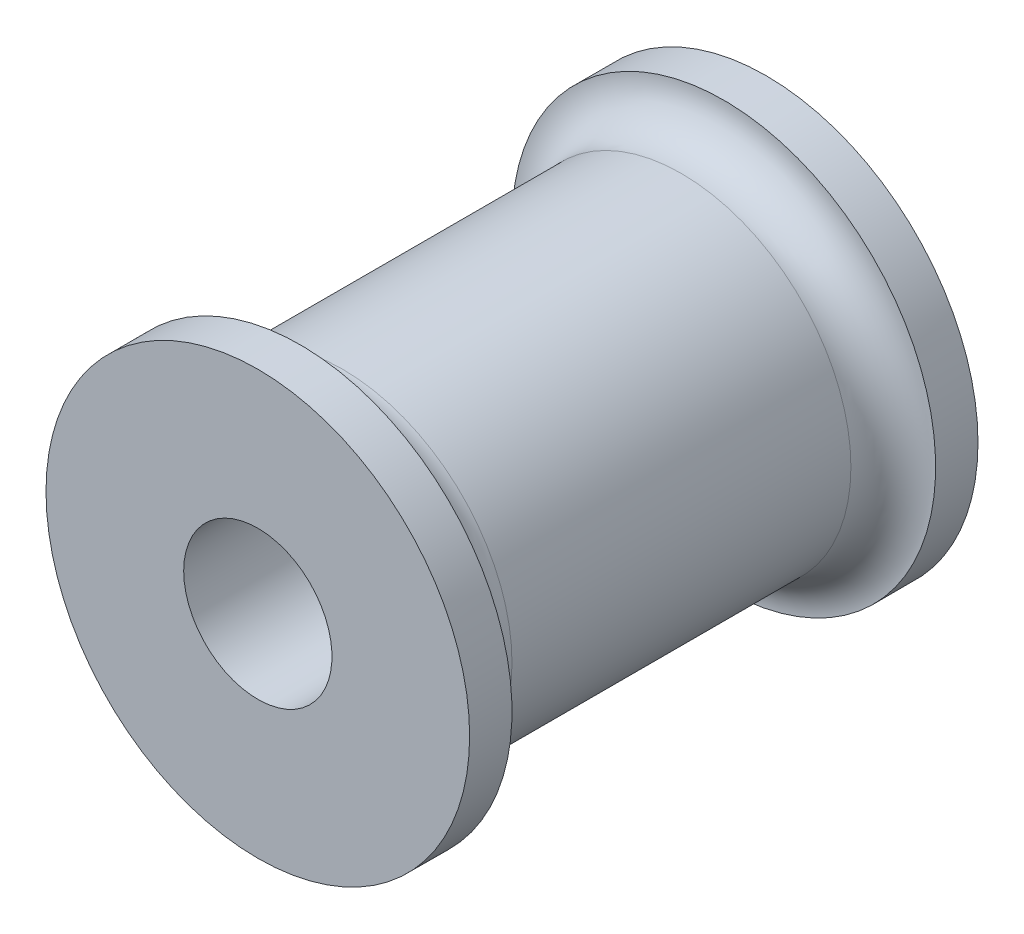
ISO-10303-21;
HEADER;
FILE_DESCRIPTION(('STEP AP214'),'2;1');
FILE_NAME('part.step','',(''),(''),'','','');
FILE_SCHEMA(('AUTOMOTIVE_DESIGN { 1 0 10303 214 1 1 1 1 }'));
ENDSEC;
DATA;
#1=APPLICATION_CONTEXT('core data for automotive mechanical design processes');
#2=APPLICATION_PROTOCOL_DEFINITION('international standard','automotive_design',2000,#1);
#3=PRODUCT_CONTEXT('',#1,'mechanical');
#4=PRODUCT('Part','Part','',(#3));
#5=PRODUCT_RELATED_PRODUCT_CATEGORY('part','',(#4));
#6=PRODUCT_DEFINITION_FORMATION('','',#4);
#7=PRODUCT_DEFINITION_CONTEXT('part definition',#1,'design');
#8=PRODUCT_DEFINITION('design','',#6,#7);
#9=PRODUCT_DEFINITION_SHAPE('','',#8);
#10=(LENGTH_UNIT() NAMED_UNIT(*) SI_UNIT(.MILLI.,.METRE.));
#11=(NAMED_UNIT(*) PLANE_ANGLE_UNIT() SI_UNIT($,.RADIAN.));
#12=(NAMED_UNIT(*) SI_UNIT($,.STERADIAN.) SOLID_ANGLE_UNIT());
#13=UNCERTAINTY_MEASURE_WITH_UNIT(LENGTH_MEASURE(1.E-05),#10,'distance_accuracy_value','');
#14=(GEOMETRIC_REPRESENTATION_CONTEXT(3) GLOBAL_UNCERTAINTY_ASSIGNED_CONTEXT((#13)) GLOBAL_UNIT_ASSIGNED_CONTEXT((#10,
#11,#12)) REPRESENTATION_CONTEXT('',''));
#15=CARTESIAN_POINT('',(0.,0.,0.));
#16=DIRECTION('',(0.,0.,1.));
#17=DIRECTION('',(1.,0.,0.));
#18=AXIS2_PLACEMENT_3D('',#15,#16,#17);
#19=CARTESIAN_POINT('',(0.,0.,24.));
#20=DIRECTION('',(0.,0.,-1.));
#21=DIRECTION('',(-1.,0.,0.));
#22=AXIS2_PLACEMENT_3D('',#19,#20,#21);
#23=CYLINDRICAL_SURFACE('',#22,10.);
#24=CARTESIAN_POINT('',(0.,0.,2.));
#25=DIRECTION('',(0.,0.,-1.));
#26=DIRECTION('',(-1.,0.,0.));
#27=AXIS2_PLACEMENT_3D('',#24,#25,#26);
#28=CIRCLE('',#27,10.);
#29=CARTESIAN_POINT('',(-10.,0.,2.));
#30=VERTEX_POINT('',#29);
#31=EDGE_CURVE('E52',#30,#30,#28,.T.);
#32=ORIENTED_EDGE('',*,*,#31,.T.);
#33=EDGE_LOOP('',(#32));
#34=FACE_BOUND('',#33,.T.);
#35=CARTESIAN_POINT('',(0.,0.,0.));
#36=DIRECTION('',(0.,0.,1.));
#37=DIRECTION('',(1.,0.,0.));
#38=AXIS2_PLACEMENT_3D('',#35,#36,#37);
#39=CIRCLE('',#38,10.);
#40=CARTESIAN_POINT('',(10.,0.,0.));
#41=VERTEX_POINT('',#40);
#42=EDGE_CURVE('E35',#41,#41,#39,.T.);
#43=ORIENTED_EDGE('',*,*,#42,.T.);
#44=EDGE_LOOP('',(#43));
#45=FACE_BOUND('',#44,.T.);
#46=ADVANCED_FACE('F31',(#34,#45),#23,.T.);
#47=CARTESIAN_POINT('',(0.,0.,0.));
#48=DIRECTION('',(0.,0.,1.));
#49=DIRECTION('',(1.,0.,0.));
#50=AXIS2_PLACEMENT_3D('',#47,#48,#49);
#51=PLANE('',#50);
#52=CARTESIAN_POINT('',(0.,0.,0.));
#53=DIRECTION('',(0.,0.,-1.));
#54=DIRECTION('',(-1.,0.,0.));
#55=AXIS2_PLACEMENT_3D('',#52,#53,#54);
#56=CIRCLE('',#55,3.5);
#57=CARTESIAN_POINT('',(-3.5,0.,0.));
#58=VERTEX_POINT('',#57);
#59=EDGE_CURVE('E56',#58,#58,#56,.T.);
#60=ORIENTED_EDGE('',*,*,#59,.F.);
#61=EDGE_LOOP('',(#60));
#62=FACE_BOUND('',#61,.T.);
#63=ORIENTED_EDGE('',*,*,#42,.F.);
#64=EDGE_LOOP('',(#63));
#65=FACE_BOUND('',#64,.T.);
#66=ADVANCED_FACE('F70',(#62,#65),#51,.F.);
#67=CARTESIAN_POINT('',(0.,0.,4.));
#68=DIRECTION('',(0.,0.,-1.));
#69=DIRECTION('',(-1.,0.,0.));
#70=AXIS2_PLACEMENT_3D('',#67,#68,#69);
#71=TOROIDAL_SURFACE('',#70,10.,2.);
#72=ORIENTED_EDGE('',*,*,#31,.F.);
#73=EDGE_LOOP('',(#72));
#74=FACE_BOUND('',#73,.T.);
#75=CARTESIAN_POINT('',(0.,0.,4.));
#76=DIRECTION('',(0.,0.,-1.));
#77=DIRECTION('',(-1.,0.,0.));
#78=AXIS2_PLACEMENT_3D('',#75,#76,#77);
#79=CIRCLE('',#78,8.);
#80=CARTESIAN_POINT('',(-8.,0.,4.));
#81=VERTEX_POINT('',#80);
#82=EDGE_CURVE('E42',#81,#81,#79,.T.);
#83=ORIENTED_EDGE('',*,*,#82,.T.);
#84=EDGE_LOOP('',(#83));
#85=FACE_BOUND('',#84,.T.);
#86=ADVANCED_FACE('F73',(#74,#85),#71,.F.);
#87=CARTESIAN_POINT('',(0.,0.,-0.3));
#88=DIRECTION('',(0.,0.,-1.));
#89=DIRECTION('',(-1.,0.,0.));
#90=AXIS2_PLACEMENT_3D('',#87,#88,#89);
#91=CYLINDRICAL_SURFACE('',#90,8.);
#92=ORIENTED_EDGE('',*,*,#82,.F.);
#93=EDGE_LOOP('',(#92));
#94=FACE_BOUND('',#93,.T.);
#95=CARTESIAN_POINT('',(0.,0.,20.));
#96=DIRECTION('',(0.,0.,-1.));
#97=DIRECTION('',(-1.,0.,0.));
#98=AXIS2_PLACEMENT_3D('',#95,#96,#97);
#99=CIRCLE('',#98,8.);
#100=CARTESIAN_POINT('',(-8.,0.,20.));
#101=VERTEX_POINT('',#100);
#102=EDGE_CURVE('E46',#101,#101,#99,.T.);
#103=ORIENTED_EDGE('',*,*,#102,.T.);
#104=EDGE_LOOP('',(#103));
#105=FACE_BOUND('',#104,.T.);
#106=ADVANCED_FACE('F91',(#94,#105),#91,.T.);
#107=CARTESIAN_POINT('',(0.,0.,20.));
#108=DIRECTION('',(0.,0.,-1.));
#109=DIRECTION('',(-1.,0.,0.));
#110=AXIS2_PLACEMENT_3D('',#107,#108,#109);
#111=TOROIDAL_SURFACE('',#110,10.,2.);
#112=ORIENTED_EDGE('',*,*,#102,.F.);
#113=EDGE_LOOP('',(#112));
#114=FACE_BOUND('',#113,.T.);
#115=CARTESIAN_POINT('',(0.,0.,22.));
#116=DIRECTION('',(0.,0.,-1.));
#117=DIRECTION('',(-1.,0.,0.));
#118=AXIS2_PLACEMENT_3D('',#115,#116,#117);
#119=CIRCLE('',#118,10.);
#120=CARTESIAN_POINT('',(-10.,0.,22.));
#121=VERTEX_POINT('',#120);
#122=EDGE_CURVE('E49',#121,#121,#119,.T.);
#123=ORIENTED_EDGE('',*,*,#122,.T.);
#124=EDGE_LOOP('',(#123));
#125=FACE_BOUND('',#124,.T.);
#126=ADVANCED_FACE('F85',(#114,#125),#111,.F.);
#127=CARTESIAN_POINT('',(0.,0.,24.));
#128=DIRECTION('',(0.,0.,1.));
#129=DIRECTION('',(1.,0.,0.));
#130=AXIS2_PLACEMENT_3D('',#127,#128,#129);
#131=PLANE('',#130);
#132=CARTESIAN_POINT('',(0.,0.,24.));
#133=DIRECTION('',(0.,0.,-1.));
#134=DIRECTION('',(-1.,0.,0.));
#135=AXIS2_PLACEMENT_3D('',#132,#133,#134);
#136=CIRCLE('',#135,3.5);
#137=CARTESIAN_POINT('',(-3.5,0.,24.));
#138=VERTEX_POINT('',#137);
#139=EDGE_CURVE('E55',#138,#138,#136,.T.);
#140=ORIENTED_EDGE('',*,*,#139,.T.);
#141=EDGE_LOOP('',(#140));
#142=FACE_BOUND('',#141,.T.);
#143=CARTESIAN_POINT('',(0.,0.,24.));
#144=DIRECTION('',(0.,0.,1.));
#145=DIRECTION('',(1.,0.,0.));
#146=AXIS2_PLACEMENT_3D('',#143,#144,#145);
#147=CIRCLE('',#146,10.);
#148=CARTESIAN_POINT('',(10.,0.,24.));
#149=VERTEX_POINT('',#148);
#150=EDGE_CURVE('E10',#149,#149,#147,.T.);
#151=ORIENTED_EDGE('',*,*,#150,.T.);
#152=EDGE_LOOP('',(#151));
#153=FACE_BOUND('',#152,.T.);
#154=ADVANCED_FACE('F62',(#142,#153),#131,.T.);
#155=ORIENTED_EDGE('',*,*,#122,.F.);
#156=EDGE_LOOP('',(#155));
#157=FACE_BOUND('',#156,.T.);
#158=ORIENTED_EDGE('',*,*,#150,.F.);
#159=EDGE_LOOP('',(#158));
#160=FACE_BOUND('',#159,.T.);
#161=ADVANCED_FACE('F33',(#157,#160),#23,.T.);
#162=CARTESIAN_POINT('',(0.,0.,24.));
#163=DIRECTION('',(0.,0.,-1.));
#164=DIRECTION('',(-1.,0.,0.));
#165=AXIS2_PLACEMENT_3D('',#162,#163,#164);
#166=CYLINDRICAL_SURFACE('',#165,3.5);
#167=ORIENTED_EDGE('',*,*,#139,.F.);
#168=EDGE_LOOP('',(#167));
#169=FACE_BOUND('',#168,.T.);
#170=ORIENTED_EDGE('',*,*,#59,.T.);
#171=EDGE_LOOP('',(#170));
#172=FACE_BOUND('',#171,.T.);
#173=ADVANCED_FACE('F64',(#169,#172),#166,.F.);
#174=CLOSED_SHELL('',(#46,#66,#86,#106,#126,#154,#161,#173));
#175=MANIFOLD_SOLID_BREP('B2',#174);
#176=ADVANCED_BREP_SHAPE_REPRESENTATION('',(#18,#175),#14);
#177=SHAPE_DEFINITION_REPRESENTATION(#9,#176);
ENDSEC;
END-ISO-10303-21;
